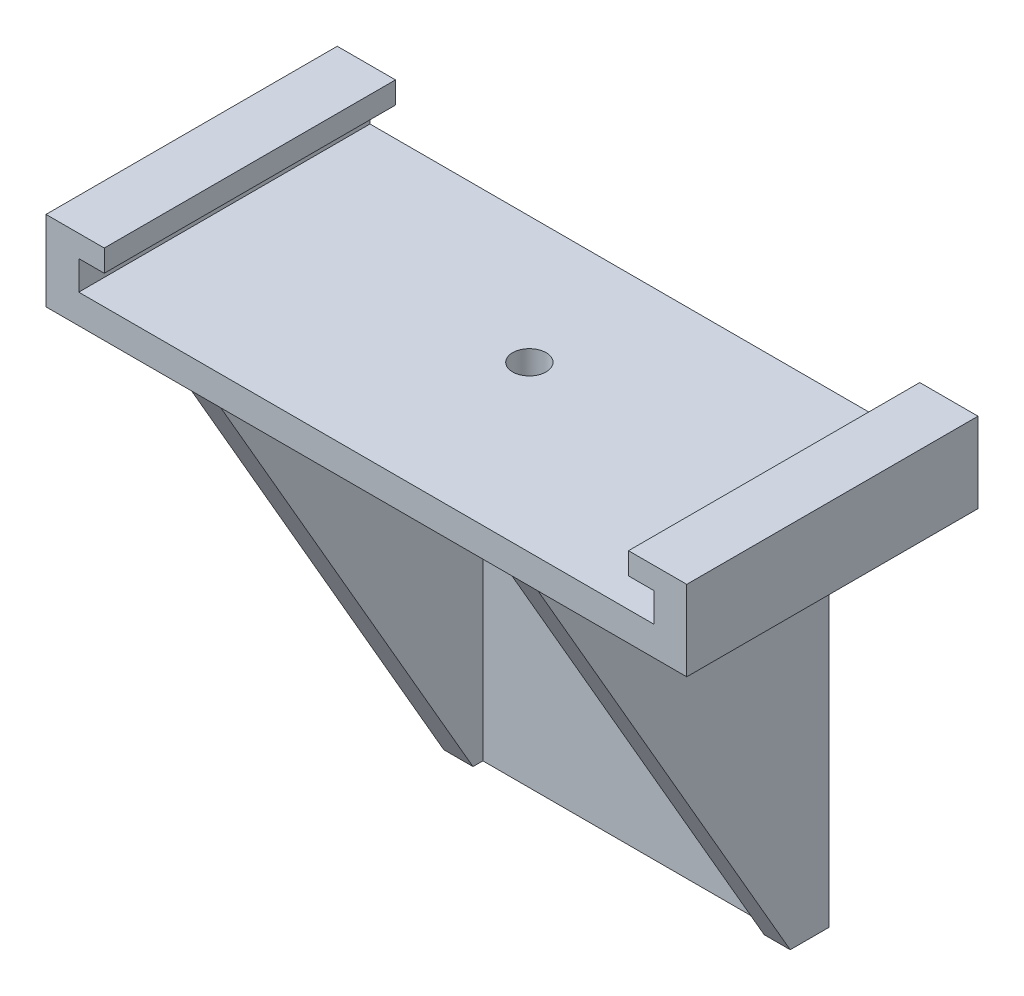
ISO-10303-21;
HEADER;
FILE_DESCRIPTION(('STEP AP214'),'2;1');
FILE_NAME('part.step','',(''),(''),'','','');
FILE_SCHEMA(('AUTOMOTIVE_DESIGN { 1 0 10303 214 1 1 1 1 }'));
ENDSEC;
DATA;
#1=APPLICATION_CONTEXT('core data for automotive mechanical design processes');
#2=APPLICATION_PROTOCOL_DEFINITION('international standard','automotive_design',2000,#1);
#3=PRODUCT_CONTEXT('',#1,'mechanical');
#4=PRODUCT('Part','Part','',(#3));
#5=PRODUCT_RELATED_PRODUCT_CATEGORY('part','',(#4));
#6=PRODUCT_DEFINITION_FORMATION('','',#4);
#7=PRODUCT_DEFINITION_CONTEXT('part definition',#1,'design');
#8=PRODUCT_DEFINITION('design','',#6,#7);
#9=PRODUCT_DEFINITION_SHAPE('','',#8);
#10=(LENGTH_UNIT() NAMED_UNIT(*) SI_UNIT(.MILLI.,.METRE.));
#11=(NAMED_UNIT(*) PLANE_ANGLE_UNIT() SI_UNIT($,.RADIAN.));
#12=(NAMED_UNIT(*) SI_UNIT($,.STERADIAN.) SOLID_ANGLE_UNIT());
#13=UNCERTAINTY_MEASURE_WITH_UNIT(LENGTH_MEASURE(1.E-05),#10,'distance_accuracy_value','');
#14=(GEOMETRIC_REPRESENTATION_CONTEXT(3) GLOBAL_UNCERTAINTY_ASSIGNED_CONTEXT((#13)) GLOBAL_UNIT_ASSIGNED_CONTEXT((#10,
#11,#12)) REPRESENTATION_CONTEXT('',''));
#15=CARTESIAN_POINT('',(0.,0.,0.));
#16=DIRECTION('',(0.,0.,1.));
#17=DIRECTION('',(1.,0.,0.));
#18=AXIS2_PLACEMENT_3D('',#15,#16,#17);
#19=CARTESIAN_POINT('',(0.,0.,0.));
#20=DIRECTION('',(0.,-1.,0.));
#21=DIRECTION('',(0.,0.,-1.));
#22=AXIS2_PLACEMENT_3D('',#19,#20,#21);
#23=PLANE('',#22);
#24=DIRECTION('',(-1.,0.,0.));
#25=VECTOR('',#24,1.);
#26=CARTESIAN_POINT('',(22.,0.,-10.));
#27=LINE('',#26,#25);
#28=CARTESIAN_POINT('',(-12.,0.,-10.));
#29=VERTEX_POINT('',#28);
#30=CARTESIAN_POINT('',(-22.,0.,-10.));
#31=VERTEX_POINT('',#30);
#32=EDGE_CURVE('E316',#29,#31,#27,.T.);
#33=ORIENTED_EDGE('',*,*,#32,.F.);
#34=DIRECTION('',(0.,0.,1.));
#35=VECTOR('',#34,1.);
#36=CARTESIAN_POINT('',(-12.,0.,0.));
#37=LINE('',#36,#35);
#38=CARTESIAN_POINT('',(-12.,0.,10.));
#39=VERTEX_POINT('',#38);
#40=EDGE_CURVE('E182',#29,#39,#37,.T.);
#41=ORIENTED_EDGE('',*,*,#40,.T.);
#42=DIRECTION('',(1.,0.,0.));
#43=VECTOR('',#42,1.);
#44=CARTESIAN_POINT('',(22.,0.,9.99999999999999));
#45=LINE('',#44,#43);
#46=CARTESIAN_POINT('',(-22.,0.,10.));
#47=VERTEX_POINT('',#46);
#48=EDGE_CURVE('E310',#47,#39,#45,.T.);
#49=ORIENTED_EDGE('',*,*,#48,.F.);
#50=DIRECTION('',(0.,0.,1.));
#51=VECTOR('',#50,1.);
#52=CARTESIAN_POINT('',(-22.,0.,-10.));
#53=LINE('',#52,#51);
#54=EDGE_CURVE('E300',#31,#47,#53,.T.);
#55=ORIENTED_EDGE('',*,*,#54,.F.);
#56=EDGE_LOOP('',(#33,#41,#49,#55));
#57=FACE_BOUND('',#56,.T.);
#58=ADVANCED_FACE('F37',(#57),#23,.T.);
#59=CARTESIAN_POINT('',(-0.107654086127998,0.,-1.30000000000001));
#60=DIRECTION('',(0.,-1.,0.));
#61=DIRECTION('',(0.,0.,-1.));
#62=AXIS2_PLACEMENT_3D('',#59,#60,#61);
#63=CIRCLE('',#62,1.15);
#64=CARTESIAN_POINT('',(-0.107654086127998,0.,-2.45000000000001));
#65=VERTEX_POINT('',#64);
#66=EDGE_CURVE('E206',#65,#65,#63,.T.);
#67=ORIENTED_EDGE('',*,*,#66,.F.);
#68=EDGE_LOOP('',(#67));
#69=FACE_BOUND('',#68,.T.);
#70=CARTESIAN_POINT('',(-10.,0.,9.99999999999999));
#71=VERTEX_POINT('',#70);
#72=CARTESIAN_POINT('',(10.,0.,9.99999999999999));
#73=VERTEX_POINT('',#72);
#74=EDGE_CURVE('E314',#71,#73,#45,.T.);
#75=ORIENTED_EDGE('',*,*,#74,.F.);
#76=DIRECTION('',(0.,0.,-1.));
#77=VECTOR('',#76,1.);
#78=CARTESIAN_POINT('',(-10.,0.,0.));
#79=LINE('',#78,#77);
#80=CARTESIAN_POINT('',(-10.,0.,-8.));
#81=VERTEX_POINT('',#80);
#82=EDGE_CURVE('E201',#71,#81,#79,.T.);
#83=ORIENTED_EDGE('',*,*,#82,.T.);
#84=DIRECTION('',(1.,0.,0.));
#85=VECTOR('',#84,1.);
#86=CARTESIAN_POINT('',(0.,0.,-8.00000000000001));
#87=LINE('',#86,#85);
#88=CARTESIAN_POINT('',(10.,0.,-8.));
#89=VERTEX_POINT('',#88);
#90=EDGE_CURVE('E203',#81,#89,#87,.T.);
#91=ORIENTED_EDGE('',*,*,#90,.T.);
#92=DIRECTION('',(0.,0.,-1.));
#93=VECTOR('',#92,1.);
#94=CARTESIAN_POINT('',(10.,0.,0.));
#95=LINE('',#94,#93);
#96=EDGE_CURVE('E221',#73,#89,#95,.T.);
#97=ORIENTED_EDGE('',*,*,#96,.F.);
#98=EDGE_LOOP('',(#75,#83,#91,#97));
#99=FACE_BOUND('',#98,.T.);
#100=ADVANCED_FACE('F358',(#69,#99),#23,.T.);
#101=CARTESIAN_POINT('',(0.,2.,0.));
#102=DIRECTION('',(0.,-1.,0.));
#103=DIRECTION('',(0.,0.,-1.));
#104=AXIS2_PLACEMENT_3D('',#101,#102,#103);
#105=PLANE('',#104);
#106=CARTESIAN_POINT('',(-0.107654086127998,2.,-1.30000000000001));
#107=DIRECTION('',(0.,-1.,0.));
#108=DIRECTION('',(0.,0.,-1.));
#109=AXIS2_PLACEMENT_3D('',#106,#107,#108);
#110=CIRCLE('',#109,1.15);
#111=CARTESIAN_POINT('',(-0.107654086127998,2.,-2.45000000000001));
#112=VERTEX_POINT('',#111);
#113=EDGE_CURVE('E41',#112,#112,#110,.T.);
#114=ORIENTED_EDGE('',*,*,#113,.T.);
#115=EDGE_LOOP('',(#114));
#116=FACE_BOUND('',#115,.T.);
#117=DIRECTION('',(0.,0.,1.));
#118=VECTOR('',#117,1.);
#119=CARTESIAN_POINT('',(19.75,2.,-10.));
#120=LINE('',#119,#118);
#121=CARTESIAN_POINT('',(19.75,2.,-10.));
#122=VERTEX_POINT('',#121);
#123=CARTESIAN_POINT('',(19.75,2.,9.99999999999999));
#124=VERTEX_POINT('',#123);
#125=EDGE_CURVE('E276',#122,#124,#120,.T.);
#126=ORIENTED_EDGE('',*,*,#125,.F.);
#127=DIRECTION('',(-1.,0.,0.));
#128=VECTOR('',#127,1.);
#129=CARTESIAN_POINT('',(22.,2.,-10.));
#130=LINE('',#129,#128);
#131=CARTESIAN_POINT('',(-19.75,2.,-10.));
#132=VERTEX_POINT('',#131);
#133=EDGE_CURVE('E303',#122,#132,#130,.T.);
#134=ORIENTED_EDGE('',*,*,#133,.T.);
#135=DIRECTION('',(0.,0.,-1.));
#136=VECTOR('',#135,1.);
#137=CARTESIAN_POINT('',(-19.75,2.,-10.));
#138=LINE('',#137,#136);
#139=CARTESIAN_POINT('',(-19.75,2.,10.));
#140=VERTEX_POINT('',#139);
#141=EDGE_CURVE('E288',#140,#132,#138,.T.);
#142=ORIENTED_EDGE('',*,*,#141,.F.);
#143=DIRECTION('',(1.,0.,0.));
#144=VECTOR('',#143,1.);
#145=CARTESIAN_POINT('',(22.,2.,9.99999999999999));
#146=LINE('',#145,#144);
#147=EDGE_CURVE('E301',#140,#124,#146,.T.);
#148=ORIENTED_EDGE('',*,*,#147,.T.);
#149=EDGE_LOOP('',(#126,#134,#142,#148));
#150=FACE_BOUND('',#149,.T.);
#151=ADVANCED_FACE('F364',(#116,#150),#105,.F.);
#152=CARTESIAN_POINT('',(-22.,2.,-10.));
#153=DIRECTION('',(1.,0.,0.));
#154=DIRECTION('',(0.,0.,-1.));
#155=AXIS2_PLACEMENT_3D('',#152,#153,#154);
#156=PLANE('',#155);
#157=ORIENTED_EDGE('',*,*,#54,.T.);
#158=DIRECTION('',(0.,-1.,0.));
#159=VECTOR('',#158,1.);
#160=CARTESIAN_POINT('',(-22.,2.,10.));
#161=LINE('',#160,#159);
#162=CARTESIAN_POINT('',(-22.,5.5,10.));
#163=VERTEX_POINT('',#162);
#164=EDGE_CURVE('E326',#163,#47,#161,.T.);
#165=ORIENTED_EDGE('',*,*,#164,.F.);
#166=DIRECTION('',(0.,0.,1.));
#167=VECTOR('',#166,1.);
#168=CARTESIAN_POINT('',(-22.,5.5,10.));
#169=LINE('',#168,#167);
#170=CARTESIAN_POINT('',(-22.,5.5,-10.));
#171=VERTEX_POINT('',#170);
#172=EDGE_CURVE('E254',#171,#163,#169,.T.);
#173=ORIENTED_EDGE('',*,*,#172,.F.);
#174=DIRECTION('',(0.,-1.,0.));
#175=VECTOR('',#174,1.);
#176=CARTESIAN_POINT('',(-22.,2.,-10.));
#177=LINE('',#176,#175);
#178=EDGE_CURVE('E306',#171,#31,#177,.T.);
#179=ORIENTED_EDGE('',*,*,#178,.T.);
#180=EDGE_LOOP('',(#157,#165,#173,#179));
#181=FACE_BOUND('',#180,.T.);
#182=ADVANCED_FACE('F437',(#181),#156,.F.);
#183=CARTESIAN_POINT('',(22.,2.,9.99999999999999));
#184=DIRECTION('',(0.,0.,-1.));
#185=DIRECTION('',(-1.,0.,0.));
#186=AXIS2_PLACEMENT_3D('',#183,#184,#185);
#187=PLANE('',#186);
#188=ORIENTED_EDGE('',*,*,#74,.T.);
#189=DIRECTION('',(1.,0.,0.));
#190=VECTOR('',#189,1.);
#191=CARTESIAN_POINT('',(11.784691827744,1.7186286445455E-13,9.99999999999999));
#192=LINE('',#191,#190);
#193=CARTESIAN_POINT('',(11.784691827744,0.,9.99999999999999));
#194=VERTEX_POINT('',#193);
#195=EDGE_CURVE('E335',#73,#194,#192,.T.);
#196=ORIENTED_EDGE('',*,*,#195,.T.);
#197=CARTESIAN_POINT('',(22.,0.,9.99999999999999));
#198=VERTEX_POINT('',#197);
#199=EDGE_CURVE('E309',#194,#198,#45,.T.);
#200=ORIENTED_EDGE('',*,*,#199,.T.);
#201=DIRECTION('',(0.,-1.,0.));
#202=VECTOR('',#201,1.);
#203=CARTESIAN_POINT('',(22.,2.,9.99999999999999));
#204=LINE('',#203,#202);
#205=CARTESIAN_POINT('',(22.,5.5,9.99999999999999));
#206=VERTEX_POINT('',#205);
#207=EDGE_CURVE('E323',#206,#198,#204,.T.);
#208=ORIENTED_EDGE('',*,*,#207,.F.);
#209=DIRECTION('',(1.,0.,0.));
#210=VECTOR('',#209,1.);
#211=CARTESIAN_POINT('',(18.,5.5,10.));
#212=LINE('',#211,#210);
#213=CARTESIAN_POINT('',(18.,5.5,10.));
#214=VERTEX_POINT('',#213);
#215=EDGE_CURVE('E239',#214,#206,#212,.T.);
#216=ORIENTED_EDGE('',*,*,#215,.F.);
#217=DIRECTION('',(0.,-1.,0.));
#218=VECTOR('',#217,1.);
#219=CARTESIAN_POINT('',(18.,5.5,10.));
#220=LINE('',#219,#218);
#221=CARTESIAN_POINT('',(18.,4.,10.));
#222=VERTEX_POINT('',#221);
#223=EDGE_CURVE('E242',#214,#222,#220,.T.);
#224=ORIENTED_EDGE('',*,*,#223,.T.);
#225=DIRECTION('',(1.,0.,0.));
#226=VECTOR('',#225,1.);
#227=CARTESIAN_POINT('',(18.,4.,10.));
#228=LINE('',#227,#226);
#229=CARTESIAN_POINT('',(19.75,4.,10.));
#230=VERTEX_POINT('',#229);
#231=EDGE_CURVE('E235',#222,#230,#228,.T.);
#232=ORIENTED_EDGE('',*,*,#231,.T.);
#233=DIRECTION('',(0.,-1.,0.));
#234=VECTOR('',#233,1.);
#235=CARTESIAN_POINT('',(19.75,4.,10.));
#236=LINE('',#235,#234);
#237=EDGE_CURVE('E280',#230,#124,#236,.T.);
#238=ORIENTED_EDGE('',*,*,#237,.T.);
#239=ORIENTED_EDGE('',*,*,#147,.F.);
#240=DIRECTION('',(0.,-1.,0.));
#241=VECTOR('',#240,1.);
#242=CARTESIAN_POINT('',(-19.75,4.,10.));
#243=LINE('',#242,#241);
#244=CARTESIAN_POINT('',(-19.75,4.,10.));
#245=VERTEX_POINT('',#244);
#246=EDGE_CURVE('E297',#245,#140,#243,.T.);
#247=ORIENTED_EDGE('',*,*,#246,.F.);
#248=DIRECTION('',(1.,0.,0.));
#249=VECTOR('',#248,1.);
#250=CARTESIAN_POINT('',(-18.,4.,10.));
#251=LINE('',#250,#249);
#252=CARTESIAN_POINT('',(-18.,4.,10.));
#253=VERTEX_POINT('',#252);
#254=EDGE_CURVE('E253',#245,#253,#251,.T.);
#255=ORIENTED_EDGE('',*,*,#254,.T.);
#256=DIRECTION('',(0.,-1.,0.));
#257=VECTOR('',#256,1.);
#258=CARTESIAN_POINT('',(-18.,5.5,10.));
#259=LINE('',#258,#257);
#260=CARTESIAN_POINT('',(-18.,5.5,10.));
#261=VERTEX_POINT('',#260);
#262=EDGE_CURVE('E273',#261,#253,#259,.T.);
#263=ORIENTED_EDGE('',*,*,#262,.F.);
#264=DIRECTION('',(1.,0.,0.));
#265=VECTOR('',#264,1.);
#266=CARTESIAN_POINT('',(-18.,5.5,10.));
#267=LINE('',#266,#265);
#268=EDGE_CURVE('E257',#163,#261,#267,.T.);
#269=ORIENTED_EDGE('',*,*,#268,.F.);
#270=ORIENTED_EDGE('',*,*,#164,.T.);
#271=ORIENTED_EDGE('',*,*,#48,.T.);
#272=DIRECTION('',(1.,0.,0.));
#273=VECTOR('',#272,1.);
#274=CARTESIAN_POINT('',(-10.,1.87350135405495E-13,9.99999999999999));
#275=LINE('',#274,#273);
#276=EDGE_CURVE('E333',#39,#71,#275,.T.);
#277=ORIENTED_EDGE('',*,*,#276,.T.);
#278=EDGE_LOOP('',(#188,#196,#200,#208,#216,#224,#232,#238,#239,#247,#255,#263,#269,#270,#271,#277));
#279=FACE_BOUND('',#278,.T.);
#280=ADVANCED_FACE('F345',(#279),#187,.F.);
#281=CARTESIAN_POINT('',(22.,2.,-10.));
#282=DIRECTION('',(-1.,0.,0.));
#283=DIRECTION('',(0.,0.,1.));
#284=AXIS2_PLACEMENT_3D('',#281,#282,#283);
#285=PLANE('',#284);
#286=DIRECTION('',(0.,0.,-1.));
#287=VECTOR('',#286,1.);
#288=CARTESIAN_POINT('',(22.,0.,-10.));
#289=LINE('',#288,#287);
#290=CARTESIAN_POINT('',(22.,0.,-10.));
#291=VERTEX_POINT('',#290);
#292=EDGE_CURVE('E313',#198,#291,#289,.T.);
#293=ORIENTED_EDGE('',*,*,#292,.T.);
#294=DIRECTION('',(0.,-1.,0.));
#295=VECTOR('',#294,1.);
#296=CARTESIAN_POINT('',(22.,2.,-10.));
#297=LINE('',#296,#295);
#298=CARTESIAN_POINT('',(22.,5.5,-10.));
#299=VERTEX_POINT('',#298);
#300=EDGE_CURVE('E320',#299,#291,#297,.T.);
#301=ORIENTED_EDGE('',*,*,#300,.F.);
#302=DIRECTION('',(0.,0.,-1.));
#303=VECTOR('',#302,1.);
#304=CARTESIAN_POINT('',(22.,5.5,9.99999999999999));
#305=LINE('',#304,#303);
#306=EDGE_CURVE('E231',#206,#299,#305,.T.);
#307=ORIENTED_EDGE('',*,*,#306,.F.);
#308=ORIENTED_EDGE('',*,*,#207,.T.);
#309=EDGE_LOOP('',(#293,#301,#307,#308));
#310=FACE_BOUND('',#309,.T.);
#311=ADVANCED_FACE('F378',(#310),#285,.F.);
#312=CARTESIAN_POINT('',(22.,2.,-10.));
#313=DIRECTION('',(0.,0.,1.));
#314=DIRECTION('',(1.,0.,0.));
#315=AXIS2_PLACEMENT_3D('',#312,#313,#314);
#316=PLANE('',#315);
#317=CARTESIAN_POINT('',(11.784691827744,0.,-10.));
#318=VERTEX_POINT('',#317);
#319=EDGE_CURVE('E304',#291,#318,#27,.T.);
#320=ORIENTED_EDGE('',*,*,#319,.T.);
#321=DIRECTION('',(0.,1.,0.));
#322=VECTOR('',#321,1.);
#323=CARTESIAN_POINT('',(11.784691827744,-30.,-10.));
#324=LINE('',#323,#322);
#325=CARTESIAN_POINT('',(11.784691827744,-30.,-10.));
#326=VERTEX_POINT('',#325);
#327=EDGE_CURVE('E185',#326,#318,#324,.T.);
#328=ORIENTED_EDGE('',*,*,#327,.F.);
#329=DIRECTION('',(1.,0.,0.));
#330=VECTOR('',#329,1.);
#331=CARTESIAN_POINT('',(0.,-30.,-10.));
#332=LINE('',#331,#330);
#333=CARTESIAN_POINT('',(-12.,-30.,-10.));
#334=VERTEX_POINT('',#333);
#335=EDGE_CURVE('E188',#334,#326,#332,.T.);
#336=ORIENTED_EDGE('',*,*,#335,.F.);
#337=DIRECTION('',(0.,1.,0.));
#338=VECTOR('',#337,1.);
#339=CARTESIAN_POINT('',(-12.,-30.,-10.));
#340=LINE('',#339,#338);
#341=EDGE_CURVE('E176',#334,#29,#340,.T.);
#342=ORIENTED_EDGE('',*,*,#341,.T.);
#343=ORIENTED_EDGE('',*,*,#32,.T.);
#344=ORIENTED_EDGE('',*,*,#178,.F.);
#345=DIRECTION('',(-1.,0.,0.));
#346=VECTOR('',#345,1.);
#347=CARTESIAN_POINT('',(-22.,5.5,-10.));
#348=LINE('',#347,#346);
#349=CARTESIAN_POINT('',(-18.,5.5,-10.));
#350=VERTEX_POINT('',#349);
#351=EDGE_CURVE('E262',#350,#171,#348,.T.);
#352=ORIENTED_EDGE('',*,*,#351,.F.);
#353=DIRECTION('',(0.,-1.,0.));
#354=VECTOR('',#353,1.);
#355=CARTESIAN_POINT('',(-18.,5.5,-10.));
#356=LINE('',#355,#354);
#357=CARTESIAN_POINT('',(-18.,4.,-10.));
#358=VERTEX_POINT('',#357);
#359=EDGE_CURVE('E265',#350,#358,#356,.T.);
#360=ORIENTED_EDGE('',*,*,#359,.T.);
#361=DIRECTION('',(-1.,0.,0.));
#362=VECTOR('',#361,1.);
#363=CARTESIAN_POINT('',(-22.,4.,-10.));
#364=LINE('',#363,#362);
#365=CARTESIAN_POINT('',(-19.75,4.,-10.));
#366=VERTEX_POINT('',#365);
#367=EDGE_CURVE('E258',#358,#366,#364,.T.);
#368=ORIENTED_EDGE('',*,*,#367,.T.);
#369=DIRECTION('',(0.,-1.,0.));
#370=VECTOR('',#369,1.);
#371=CARTESIAN_POINT('',(-19.75,4.,-10.));
#372=LINE('',#371,#370);
#373=EDGE_CURVE('E292',#366,#132,#372,.T.);
#374=ORIENTED_EDGE('',*,*,#373,.T.);
#375=ORIENTED_EDGE('',*,*,#133,.F.);
#376=DIRECTION('',(0.,-1.,0.));
#377=VECTOR('',#376,1.);
#378=CARTESIAN_POINT('',(19.75,4.,-10.));
#379=LINE('',#378,#377);
#380=CARTESIAN_POINT('',(19.75,4.,-10.));
#381=VERTEX_POINT('',#380);
#382=EDGE_CURVE('E285',#381,#122,#379,.T.);
#383=ORIENTED_EDGE('',*,*,#382,.F.);
#384=DIRECTION('',(-1.,0.,0.));
#385=VECTOR('',#384,1.);
#386=CARTESIAN_POINT('',(22.,4.,-10.));
#387=LINE('',#386,#385);
#388=CARTESIAN_POINT('',(18.,4.,-10.));
#389=VERTEX_POINT('',#388);
#390=EDGE_CURVE('E184',#381,#389,#387,.T.);
#391=ORIENTED_EDGE('',*,*,#390,.T.);
#392=DIRECTION('',(0.,-1.,0.));
#393=VECTOR('',#392,1.);
#394=CARTESIAN_POINT('',(18.,5.5,-10.));
#395=LINE('',#394,#393);
#396=CARTESIAN_POINT('',(18.,5.5,-10.));
#397=VERTEX_POINT('',#396);
#398=EDGE_CURVE('E250',#397,#389,#395,.T.);
#399=ORIENTED_EDGE('',*,*,#398,.F.);
#400=DIRECTION('',(-1.,0.,0.));
#401=VECTOR('',#400,1.);
#402=CARTESIAN_POINT('',(22.,5.5,-10.));
#403=LINE('',#402,#401);
#404=EDGE_CURVE('E234',#299,#397,#403,.T.);
#405=ORIENTED_EDGE('',*,*,#404,.F.);
#406=ORIENTED_EDGE('',*,*,#300,.T.);
#407=EDGE_LOOP('',(#320,#328,#336,#342,#343,#344,#352,#360,#368,#374,#375,#383,#391,#399,#405,#406));
#408=FACE_BOUND('',#407,.T.);
#409=ADVANCED_FACE('F190',(#408),#316,.F.);
#410=DIRECTION('',(0.,0.,1.));
#411=VECTOR('',#410,1.);
#412=CARTESIAN_POINT('',(11.784691827744,0.,0.));
#413=LINE('',#412,#411);
#414=EDGE_CURVE('E218',#318,#194,#413,.T.);
#415=ORIENTED_EDGE('',*,*,#414,.F.);
#416=ORIENTED_EDGE('',*,*,#319,.F.);
#417=ORIENTED_EDGE('',*,*,#292,.F.);
#418=ORIENTED_EDGE('',*,*,#199,.F.);
#419=EDGE_LOOP('',(#415,#416,#417,#418));
#420=FACE_BOUND('',#419,.T.);
#421=ADVANCED_FACE('F360',(#420),#23,.T.);
#422=CARTESIAN_POINT('',(-19.75,4.,-10.));
#423=DIRECTION('',(-1.,0.,0.));
#424=DIRECTION('',(0.,0.,1.));
#425=AXIS2_PLACEMENT_3D('',#422,#423,#424);
#426=PLANE('',#425);
#427=ORIENTED_EDGE('',*,*,#141,.T.);
#428=ORIENTED_EDGE('',*,*,#373,.F.);
#429=DIRECTION('',(0.,0.,-1.));
#430=VECTOR('',#429,1.);
#431=CARTESIAN_POINT('',(-19.75,4.,-10.));
#432=LINE('',#431,#430);
#433=EDGE_CURVE('E289',#245,#366,#432,.T.);
#434=ORIENTED_EDGE('',*,*,#433,.F.);
#435=ORIENTED_EDGE('',*,*,#246,.T.);
#436=EDGE_LOOP('',(#427,#428,#434,#435));
#437=FACE_BOUND('',#436,.T.);
#438=ADVANCED_FACE('F369',(#437),#426,.F.);
#439=CARTESIAN_POINT('',(19.75,4.,-10.));
#440=DIRECTION('',(1.,0.,0.));
#441=DIRECTION('',(0.,0.,-1.));
#442=AXIS2_PLACEMENT_3D('',#439,#440,#441);
#443=PLANE('',#442);
#444=ORIENTED_EDGE('',*,*,#125,.T.);
#445=ORIENTED_EDGE('',*,*,#237,.F.);
#446=DIRECTION('',(0.,0.,1.));
#447=VECTOR('',#446,1.);
#448=CARTESIAN_POINT('',(19.75,4.,-10.));
#449=LINE('',#448,#447);
#450=EDGE_CURVE('E277',#381,#230,#449,.T.);
#451=ORIENTED_EDGE('',*,*,#450,.F.);
#452=ORIENTED_EDGE('',*,*,#382,.T.);
#453=EDGE_LOOP('',(#444,#445,#451,#452));
#454=FACE_BOUND('',#453,.T.);
#455=ADVANCED_FACE('F375',(#454),#443,.F.);
#456=CARTESIAN_POINT('',(0.,4.,0.));
#457=DIRECTION('',(0.,-1.,0.));
#458=DIRECTION('',(0.,0.,-1.));
#459=AXIS2_PLACEMENT_3D('',#456,#457,#458);
#460=PLANE('',#459);
#461=ORIENTED_EDGE('',*,*,#433,.T.);
#462=ORIENTED_EDGE('',*,*,#367,.F.);
#463=DIRECTION('',(0.,0.,-1.));
#464=VECTOR('',#463,1.);
#465=CARTESIAN_POINT('',(-18.,4.,-10.));
#466=LINE('',#465,#464);
#467=EDGE_CURVE('E267',#253,#358,#466,.T.);
#468=ORIENTED_EDGE('',*,*,#467,.F.);
#469=ORIENTED_EDGE('',*,*,#254,.F.);
#470=EDGE_LOOP('',(#461,#462,#468,#469));
#471=FACE_BOUND('',#470,.T.);
#472=ADVANCED_FACE('F427',(#471),#460,.T.);
#473=CARTESIAN_POINT('',(-18.,5.5,-10.));
#474=DIRECTION('',(-1.,0.,0.));
#475=DIRECTION('',(0.,0.,1.));
#476=AXIS2_PLACEMENT_3D('',#473,#474,#475);
#477=PLANE('',#476);
#478=ORIENTED_EDGE('',*,*,#467,.T.);
#479=ORIENTED_EDGE('',*,*,#359,.F.);
#480=DIRECTION('',(0.,0.,-1.));
#481=VECTOR('',#480,1.);
#482=CARTESIAN_POINT('',(-18.,5.5,-10.));
#483=LINE('',#482,#481);
#484=EDGE_CURVE('E260',#261,#350,#483,.T.);
#485=ORIENTED_EDGE('',*,*,#484,.F.);
#486=ORIENTED_EDGE('',*,*,#262,.T.);
#487=EDGE_LOOP('',(#478,#479,#485,#486));
#488=FACE_BOUND('',#487,.T.);
#489=ADVANCED_FACE('F425',(#488),#477,.F.);
#490=CARTESIAN_POINT('',(0.,5.5,0.));
#491=DIRECTION('',(0.,-1.,0.));
#492=DIRECTION('',(0.,0.,-1.));
#493=AXIS2_PLACEMENT_3D('',#490,#491,#492);
#494=PLANE('',#493);
#495=ORIENTED_EDGE('',*,*,#172,.T.);
#496=ORIENTED_EDGE('',*,*,#268,.T.);
#497=ORIENTED_EDGE('',*,*,#484,.T.);
#498=ORIENTED_EDGE('',*,*,#351,.T.);
#499=EDGE_LOOP('',(#495,#496,#497,#498));
#500=FACE_BOUND('',#499,.T.);
#501=ADVANCED_FACE('F418',(#500),#494,.F.);
#502=CARTESIAN_POINT('',(0.,4.,0.));
#503=DIRECTION('',(0.,1.,0.));
#504=DIRECTION('',(0.,0.,1.));
#505=AXIS2_PLACEMENT_3D('',#502,#503,#504);
#506=PLANE('',#505);
#507=ORIENTED_EDGE('',*,*,#390,.F.);
#508=ORIENTED_EDGE('',*,*,#450,.T.);
#509=ORIENTED_EDGE('',*,*,#231,.F.);
#510=DIRECTION('',(0.,0.,1.));
#511=VECTOR('',#510,1.);
#512=CARTESIAN_POINT('',(18.,4.,-10.));
#513=LINE('',#512,#511);
#514=EDGE_CURVE('E244',#389,#222,#513,.T.);
#515=ORIENTED_EDGE('',*,*,#514,.F.);
#516=EDGE_LOOP('',(#507,#508,#509,#515));
#517=FACE_BOUND('',#516,.T.);
#518=ADVANCED_FACE('F415',(#517),#506,.F.);
#519=CARTESIAN_POINT('',(18.,5.5,-10.));
#520=DIRECTION('',(1.,0.,0.));
#521=DIRECTION('',(0.,0.,-1.));
#522=AXIS2_PLACEMENT_3D('',#519,#520,#521);
#523=PLANE('',#522);
#524=ORIENTED_EDGE('',*,*,#514,.T.);
#525=ORIENTED_EDGE('',*,*,#223,.F.);
#526=DIRECTION('',(0.,0.,1.));
#527=VECTOR('',#526,1.);
#528=CARTESIAN_POINT('',(18.,5.5,-10.));
#529=LINE('',#528,#527);
#530=EDGE_CURVE('E237',#397,#214,#529,.T.);
#531=ORIENTED_EDGE('',*,*,#530,.F.);
#532=ORIENTED_EDGE('',*,*,#398,.T.);
#533=EDGE_LOOP('',(#524,#525,#531,#532));
#534=FACE_BOUND('',#533,.T.);
#535=ADVANCED_FACE('F413',(#534),#523,.F.);
#536=CARTESIAN_POINT('',(0.,5.5,0.));
#537=DIRECTION('',(0.,1.,0.));
#538=DIRECTION('',(0.,0.,1.));
#539=AXIS2_PLACEMENT_3D('',#536,#537,#538);
#540=PLANE('',#539);
#541=ORIENTED_EDGE('',*,*,#306,.T.);
#542=ORIENTED_EDGE('',*,*,#404,.T.);
#543=ORIENTED_EDGE('',*,*,#530,.T.);
#544=ORIENTED_EDGE('',*,*,#215,.T.);
#545=EDGE_LOOP('',(#541,#542,#543,#544));
#546=FACE_BOUND('',#545,.T.);
#547=ADVANCED_FACE('F410',(#546),#540,.T.);
#548=CARTESIAN_POINT('',(-12.,-30.,0.));
#549=DIRECTION('',(-1.,0.,0.));
#550=DIRECTION('',(0.,0.,1.));
#551=AXIS2_PLACEMENT_3D('',#548,#549,#550);
#552=PLANE('',#551);
#553=DIRECTION('',(0.,0.,1.));
#554=VECTOR('',#553,1.);
#555=CARTESIAN_POINT('',(-12.,-30.,0.));
#556=LINE('',#555,#554);
#557=CARTESIAN_POINT('',(-12.,-30.,-7.3205080756888));
#558=VERTEX_POINT('',#557);
#559=EDGE_CURVE('E180',#334,#558,#556,.T.);
#560=ORIENTED_EDGE('',*,*,#559,.T.);
#561=DIRECTION('',(0.,0.86602540378444,0.499999999999998));
#562=VECTOR('',#561,1.);
#563=CARTESIAN_POINT('',(-12.,-26.8301270189222,-5.49038105676661));
#564=LINE('',#563,#562);
#565=EDGE_CURVE('E46',#558,#39,#564,.T.);
#566=ORIENTED_EDGE('',*,*,#565,.T.);
#567=ORIENTED_EDGE('',*,*,#40,.F.);
#568=ORIENTED_EDGE('',*,*,#341,.F.);
#569=EDGE_LOOP('',(#560,#566,#567,#568));
#570=FACE_BOUND('',#569,.T.);
#571=ADVANCED_FACE('F178',(#570),#552,.T.);
#572=CARTESIAN_POINT('',(11.784691827744,-30.,0.));
#573=DIRECTION('',(-1.,0.,0.));
#574=DIRECTION('',(0.,0.,1.));
#575=AXIS2_PLACEMENT_3D('',#572,#573,#574);
#576=PLANE('',#575);
#577=ORIENTED_EDGE('',*,*,#414,.T.);
#578=DIRECTION('',(0.,-0.86602540378444,-0.499999999999998));
#579=VECTOR('',#578,1.);
#580=CARTESIAN_POINT('',(11.784691827744,-30.,-7.3205080756888));
#581=LINE('',#580,#579);
#582=CARTESIAN_POINT('',(11.784691827744,-30.,-7.3205080756888));
#583=VERTEX_POINT('',#582);
#584=EDGE_CURVE('E337',#194,#583,#581,.T.);
#585=ORIENTED_EDGE('',*,*,#584,.T.);
#586=DIRECTION('',(0.,0.,1.));
#587=VECTOR('',#586,1.);
#588=CARTESIAN_POINT('',(11.784691827744,-30.,0.));
#589=LINE('',#588,#587);
#590=EDGE_CURVE('E195',#326,#583,#589,.T.);
#591=ORIENTED_EDGE('',*,*,#590,.F.);
#592=ORIENTED_EDGE('',*,*,#327,.T.);
#593=EDGE_LOOP('',(#577,#585,#591,#592));
#594=FACE_BOUND('',#593,.T.);
#595=ADVANCED_FACE('F385',(#594),#576,.F.);
#596=CARTESIAN_POINT('',(10.,-30.,0.));
#597=DIRECTION('',(1.,0.,0.));
#598=DIRECTION('',(0.,0.,-1.));
#599=AXIS2_PLACEMENT_3D('',#596,#597,#598);
#600=PLANE('',#599);
#601=DIRECTION('',(0.,0.,-1.));
#602=VECTOR('',#601,1.);
#603=CARTESIAN_POINT('',(10.,-30.,0.));
#604=LINE('',#603,#602);
#605=CARTESIAN_POINT('',(10.,-30.,-7.3205080756888));
#606=VERTEX_POINT('',#605);
#607=CARTESIAN_POINT('',(10.,-30.,-8.));
#608=VERTEX_POINT('',#607);
#609=EDGE_CURVE('E209',#606,#608,#604,.T.);
#610=ORIENTED_EDGE('',*,*,#609,.F.);
#611=DIRECTION('',(0.,0.86602540378444,0.499999999999998));
#612=VECTOR('',#611,1.);
#613=CARTESIAN_POINT('',(10.,-30.,-7.3205080756888));
#614=LINE('',#613,#612);
#615=EDGE_CURVE('E59',#606,#73,#614,.T.);
#616=ORIENTED_EDGE('',*,*,#615,.T.);
#617=ORIENTED_EDGE('',*,*,#96,.T.);
#618=DIRECTION('',(0.,1.,0.));
#619=VECTOR('',#618,1.);
#620=CARTESIAN_POINT('',(10.,-30.,-8.));
#621=LINE('',#620,#619);
#622=EDGE_CURVE('E227',#608,#89,#621,.T.);
#623=ORIENTED_EDGE('',*,*,#622,.F.);
#624=EDGE_LOOP('',(#610,#616,#617,#623));
#625=FACE_BOUND('',#624,.T.);
#626=ADVANCED_FACE('F397',(#625),#600,.F.);
#627=CARTESIAN_POINT('',(0.,-30.,-8.00000000000001));
#628=DIRECTION('',(0.,0.,1.));
#629=DIRECTION('',(1.,0.,0.));
#630=AXIS2_PLACEMENT_3D('',#627,#628,#629);
#631=PLANE('',#630);
#632=ORIENTED_EDGE('',*,*,#90,.F.);
#633=DIRECTION('',(0.,1.,0.));
#634=VECTOR('',#633,1.);
#635=CARTESIAN_POINT('',(-10.,-30.,-8.));
#636=LINE('',#635,#634);
#637=CARTESIAN_POINT('',(-10.,-30.,-8.));
#638=VERTEX_POINT('',#637);
#639=EDGE_CURVE('E216',#638,#81,#636,.T.);
#640=ORIENTED_EDGE('',*,*,#639,.F.);
#641=DIRECTION('',(1.,0.,0.));
#642=VECTOR('',#641,1.);
#643=CARTESIAN_POINT('',(0.,-30.,-8.00000000000001));
#644=LINE('',#643,#642);
#645=EDGE_CURVE('E211',#638,#608,#644,.T.);
#646=ORIENTED_EDGE('',*,*,#645,.T.);
#647=ORIENTED_EDGE('',*,*,#622,.T.);
#648=EDGE_LOOP('',(#632,#640,#646,#647));
#649=FACE_BOUND('',#648,.T.);
#650=ADVANCED_FACE('F394',(#649),#631,.T.);
#651=CARTESIAN_POINT('',(-10.,-30.,0.));
#652=DIRECTION('',(1.,0.,0.));
#653=DIRECTION('',(0.,0.,-1.));
#654=AXIS2_PLACEMENT_3D('',#651,#652,#653);
#655=PLANE('',#654);
#656=ORIENTED_EDGE('',*,*,#82,.F.);
#657=DIRECTION('',(0.,-0.86602540378444,-0.499999999999998));
#658=VECTOR('',#657,1.);
#659=CARTESIAN_POINT('',(-10.,-26.8301270189222,-5.49038105676661));
#660=LINE('',#659,#658);
#661=CARTESIAN_POINT('',(-10.,-30.,-7.3205080756888));
#662=VERTEX_POINT('',#661);
#663=EDGE_CURVE('E11',#71,#662,#660,.T.);
#664=ORIENTED_EDGE('',*,*,#663,.T.);
#665=DIRECTION('',(0.,0.,-1.));
#666=VECTOR('',#665,1.);
#667=CARTESIAN_POINT('',(-10.,-30.,0.));
#668=LINE('',#667,#666);
#669=EDGE_CURVE('E214',#662,#638,#668,.T.);
#670=ORIENTED_EDGE('',*,*,#669,.T.);
#671=ORIENTED_EDGE('',*,*,#639,.T.);
#672=EDGE_LOOP('',(#656,#664,#670,#671));
#673=FACE_BOUND('',#672,.T.);
#674=ADVANCED_FACE('F389',(#673),#655,.T.);
#675=CARTESIAN_POINT('',(0.,-30.,0.));
#676=DIRECTION('',(0.,-1.,0.));
#677=DIRECTION('',(0.,0.,-1.));
#678=AXIS2_PLACEMENT_3D('',#675,#676,#677);
#679=PLANE('',#678);
#680=ORIENTED_EDGE('',*,*,#590,.T.);
#681=DIRECTION('',(-1.,0.,0.));
#682=VECTOR('',#681,1.);
#683=CARTESIAN_POINT('',(10.,-30.,-7.3205080756888));
#684=LINE('',#683,#682);
#685=EDGE_CURVE('E330',#583,#606,#684,.T.);
#686=ORIENTED_EDGE('',*,*,#685,.T.);
#687=ORIENTED_EDGE('',*,*,#609,.T.);
#688=ORIENTED_EDGE('',*,*,#645,.F.);
#689=ORIENTED_EDGE('',*,*,#669,.F.);
#690=DIRECTION('',(-1.,0.,0.));
#691=VECTOR('',#690,1.);
#692=CARTESIAN_POINT('',(-12.,-30.,-7.3205080756888));
#693=LINE('',#692,#691);
#694=EDGE_CURVE('E200',#662,#558,#693,.T.);
#695=ORIENTED_EDGE('',*,*,#694,.T.);
#696=ORIENTED_EDGE('',*,*,#559,.F.);
#697=ORIENTED_EDGE('',*,*,#335,.T.);
#698=EDGE_LOOP('',(#680,#686,#687,#688,#689,#695,#696,#697));
#699=FACE_BOUND('',#698,.T.);
#700=ADVANCED_FACE('F198',(#699),#679,.T.);
#701=CARTESIAN_POINT('',(0.,-30.,-7.3205080756888));
#702=DIRECTION('',(0.,-0.499999999999998,0.86602540378444));
#703=DIRECTION('',(1.,0.,0.));
#704=AXIS2_PLACEMENT_3D('',#701,#702,#703);
#705=PLANE('',#704);
#706=ORIENTED_EDGE('',*,*,#584,.F.);
#707=ORIENTED_EDGE('',*,*,#195,.F.);
#708=ORIENTED_EDGE('',*,*,#615,.F.);
#709=ORIENTED_EDGE('',*,*,#685,.F.);
#710=EDGE_LOOP('',(#706,#707,#708,#709));
#711=FACE_BOUND('',#710,.T.);
#712=ADVANCED_FACE('F350',(#711),#705,.T.);
#713=CARTESIAN_POINT('',(0.,-30.,-7.3205080756888));
#714=DIRECTION('',(0.,-0.499999999999998,0.86602540378444));
#715=DIRECTION('',(1.,0.,0.));
#716=AXIS2_PLACEMENT_3D('',#713,#714,#715);
#717=PLANE('',#716);
#718=ORIENTED_EDGE('',*,*,#663,.F.);
#719=ORIENTED_EDGE('',*,*,#276,.F.);
#720=ORIENTED_EDGE('',*,*,#565,.F.);
#721=ORIENTED_EDGE('',*,*,#694,.F.);
#722=EDGE_LOOP('',(#718,#719,#720,#721));
#723=FACE_BOUND('',#722,.T.);
#724=ADVANCED_FACE('F39',(#723),#717,.T.);
#725=CARTESIAN_POINT('',(-0.107654086127998,5.5,-1.30000000000001));
#726=DIRECTION('',(0.,-1.,0.));
#727=DIRECTION('',(0.,0.,-1.));
#728=AXIS2_PLACEMENT_3D('',#725,#726,#727);
#729=CYLINDRICAL_SURFACE('',#728,1.15);
#730=ORIENTED_EDGE('',*,*,#66,.T.);
#731=EDGE_LOOP('',(#730));
#732=FACE_BOUND('',#731,.T.);
#733=ORIENTED_EDGE('',*,*,#113,.F.);
#734=EDGE_LOOP('',(#733));
#735=FACE_BOUND('',#734,.T.);
#736=ADVANCED_FACE('F349',(#732,#735),#729,.F.);
#737=CLOSED_SHELL('',(#58,#100,#151,#182,#280,#311,#409,#421,#438,#455,#472,#489,#501,#518,#535,
#547,#571,#595,#626,#650,#674,#700,#712,#724,#736));
#738=MANIFOLD_SOLID_BREP('B2',#737);
#739=ADVANCED_BREP_SHAPE_REPRESENTATION('',(#18,#738),#14);
#740=SHAPE_DEFINITION_REPRESENTATION(#9,#739);
ENDSEC;
END-ISO-10303-21;
